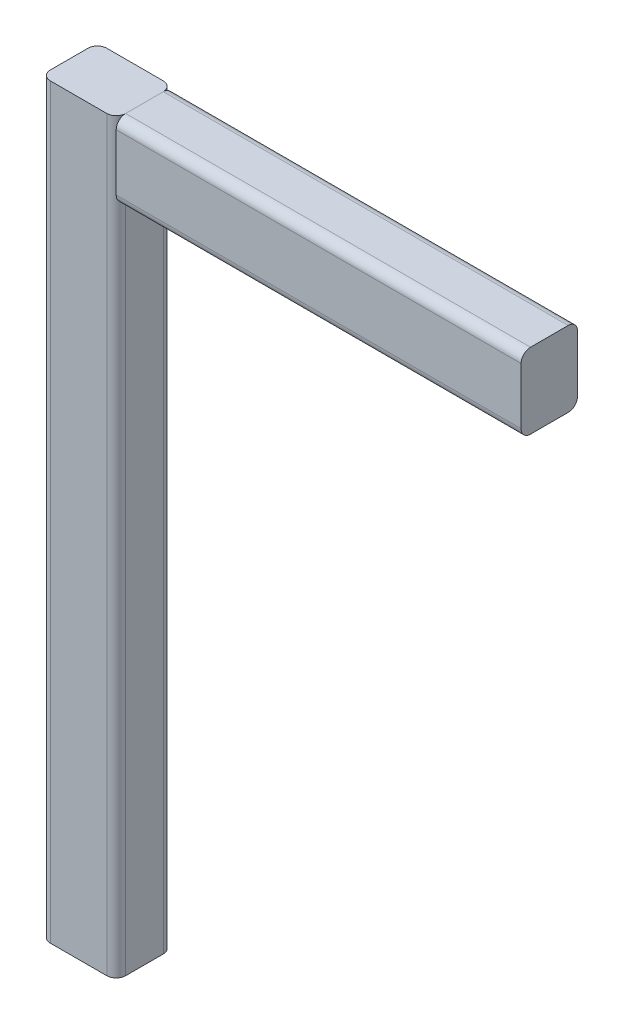
ISO-10303-21;
HEADER;
FILE_DESCRIPTION(('STEP AP214'),'2;1');
FILE_NAME('part.step','',(''),(''),'','','');
FILE_SCHEMA(('AUTOMOTIVE_DESIGN { 1 0 10303 214 1 1 1 1 }'));
ENDSEC;
DATA;
#1=APPLICATION_CONTEXT('core data for automotive mechanical design processes');
#2=APPLICATION_PROTOCOL_DEFINITION('international standard','automotive_design',2000,#1);
#3=PRODUCT_CONTEXT('',#1,'mechanical');
#4=PRODUCT('Part','Part','',(#3));
#5=PRODUCT_RELATED_PRODUCT_CATEGORY('part','',(#4));
#6=PRODUCT_DEFINITION_FORMATION('','',#4);
#7=PRODUCT_DEFINITION_CONTEXT('part definition',#1,'design');
#8=PRODUCT_DEFINITION('design','',#6,#7);
#9=PRODUCT_DEFINITION_SHAPE('','',#8);
#10=(LENGTH_UNIT() NAMED_UNIT(*) SI_UNIT(.MILLI.,.METRE.));
#11=(NAMED_UNIT(*) PLANE_ANGLE_UNIT() SI_UNIT($,.RADIAN.));
#12=(NAMED_UNIT(*) SI_UNIT($,.STERADIAN.) SOLID_ANGLE_UNIT());
#13=UNCERTAINTY_MEASURE_WITH_UNIT(LENGTH_MEASURE(1.E-05),#10,'distance_accuracy_value','');
#14=(GEOMETRIC_REPRESENTATION_CONTEXT(3) GLOBAL_UNCERTAINTY_ASSIGNED_CONTEXT((#13)) GLOBAL_UNIT_ASSIGNED_CONTEXT((#10,
#11,#12)) REPRESENTATION_CONTEXT('',''));
#15=CARTESIAN_POINT('',(0.,0.,0.));
#16=DIRECTION('',(0.,0.,1.));
#17=DIRECTION('',(1.,0.,0.));
#18=AXIS2_PLACEMENT_3D('',#15,#16,#17);
#19=CARTESIAN_POINT('',(430.,0.,0.));
#20=DIRECTION('',(0.,0.,-1.));
#21=DIRECTION('',(0.,1.,0.));
#22=AXIS2_PLACEMENT_3D('',#19,#20,#21);
#23=PLANE('',#22);
#24=DIRECTION('',(0.,-1.,0.));
#25=VECTOR('',#24,1.);
#26=CARTESIAN_POINT('',(0.,0.,0.));
#27=LINE('',#26,#25);
#28=CARTESIAN_POINT('',(0.,-10.,0.));
#29=VERTEX_POINT('',#28);
#30=CARTESIAN_POINT('',(0.,-70.,0.));
#31=VERTEX_POINT('',#30);
#32=EDGE_CURVE('E142',#29,#31,#27,.T.);
#33=ORIENTED_EDGE('',*,*,#32,.T.);
#34=DIRECTION('',(-1.,0.,0.));
#35=VECTOR('',#34,1.);
#36=CARTESIAN_POINT('',(430.,-70.,0.));
#37=LINE('',#36,#35);
#38=CARTESIAN_POINT('',(430.,-70.,0.));
#39=VERTEX_POINT('',#38);
#40=EDGE_CURVE('E12',#31,#39,#37,.F.);
#41=ORIENTED_EDGE('',*,*,#40,.T.);
#42=DIRECTION('',(0.,-1.,0.));
#43=VECTOR('',#42,1.);
#44=CARTESIAN_POINT('',(430.,0.,0.));
#45=LINE('',#44,#43);
#46=CARTESIAN_POINT('',(430.,-10.,0.));
#47=VERTEX_POINT('',#46);
#48=EDGE_CURVE('E140',#47,#39,#45,.T.);
#49=ORIENTED_EDGE('',*,*,#48,.F.);
#50=DIRECTION('',(-1.,0.,0.));
#51=VECTOR('',#50,1.);
#52=CARTESIAN_POINT('',(430.,-10.,0.));
#53=LINE('',#52,#51);
#54=EDGE_CURVE('E54',#47,#29,#53,.T.);
#55=ORIENTED_EDGE('',*,*,#54,.T.);
#56=EDGE_LOOP('',(#33,#41,#49,#55));
#57=FACE_BOUND('',#56,.T.);
#58=ADVANCED_FACE('F46',(#57),#23,.F.);
#59=CARTESIAN_POINT('',(430.,-80.,0.));
#60=DIRECTION('',(0.,1.,0.));
#61=DIRECTION('',(0.,0.,1.));
#62=AXIS2_PLACEMENT_3D('',#59,#60,#61);
#63=PLANE('',#62);
#64=DIRECTION('',(0.,0.,-1.));
#65=VECTOR('',#64,1.);
#66=CARTESIAN_POINT('',(0.,-80.,0.));
#67=LINE('',#66,#65);
#68=CARTESIAN_POINT('',(0.,-80.,-10.));
#69=VERTEX_POINT('',#68);
#70=CARTESIAN_POINT('',(0.,-80.,-50.));
#71=VERTEX_POINT('',#70);
#72=EDGE_CURVE('E138',#69,#71,#67,.T.);
#73=ORIENTED_EDGE('',*,*,#72,.T.);
#74=DIRECTION('',(-1.,0.,0.));
#75=VECTOR('',#74,1.);
#76=CARTESIAN_POINT('',(430.,-80.,-50.));
#77=LINE('',#76,#75);
#78=CARTESIAN_POINT('',(430.,-80.,-50.));
#79=VERTEX_POINT('',#78);
#80=EDGE_CURVE('E117',#71,#79,#77,.F.);
#81=ORIENTED_EDGE('',*,*,#80,.T.);
#82=DIRECTION('',(0.,0.,-1.));
#83=VECTOR('',#82,1.);
#84=CARTESIAN_POINT('',(430.,-80.,0.));
#85=LINE('',#84,#83);
#86=CARTESIAN_POINT('',(430.,-80.,-10.));
#87=VERTEX_POINT('',#86);
#88=EDGE_CURVE('E178',#87,#79,#85,.T.);
#89=ORIENTED_EDGE('',*,*,#88,.F.);
#90=DIRECTION('',(-1.,0.,0.));
#91=VECTOR('',#90,1.);
#92=CARTESIAN_POINT('',(430.,-80.,-10.));
#93=LINE('',#92,#91);
#94=EDGE_CURVE('E122',#87,#69,#93,.T.);
#95=ORIENTED_EDGE('',*,*,#94,.T.);
#96=EDGE_LOOP('',(#73,#81,#89,#95));
#97=FACE_BOUND('',#96,.T.);
#98=ADVANCED_FACE('F188',(#97),#63,.F.);
#99=CARTESIAN_POINT('',(430.,0.,-60.));
#100=DIRECTION('',(0.,0.,1.));
#101=DIRECTION('',(1.,0.,0.));
#102=AXIS2_PLACEMENT_3D('',#99,#100,#101);
#103=PLANE('',#102);
#104=DIRECTION('',(0.,1.,0.));
#105=VECTOR('',#104,1.);
#106=CARTESIAN_POINT('',(430.,0.,-60.));
#107=LINE('',#106,#105);
#108=CARTESIAN_POINT('',(430.,-70.,-60.));
#109=VERTEX_POINT('',#108);
#110=CARTESIAN_POINT('',(430.,-10.,-60.));
#111=VERTEX_POINT('',#110);
#112=EDGE_CURVE('E131',#109,#111,#107,.T.);
#113=ORIENTED_EDGE('',*,*,#112,.F.);
#114=DIRECTION('',(-1.,0.,0.));
#115=VECTOR('',#114,1.);
#116=CARTESIAN_POINT('',(430.,-70.,-60.));
#117=LINE('',#116,#115);
#118=CARTESIAN_POINT('',(0.,-70.,-60.));
#119=VERTEX_POINT('',#118);
#120=EDGE_CURVE('E116',#109,#119,#117,.T.);
#121=ORIENTED_EDGE('',*,*,#120,.T.);
#122=DIRECTION('',(0.,1.,0.));
#123=VECTOR('',#122,1.);
#124=CARTESIAN_POINT('',(0.,0.,-60.));
#125=LINE('',#124,#123);
#126=CARTESIAN_POINT('',(0.,-10.,-60.));
#127=VERTEX_POINT('',#126);
#128=EDGE_CURVE('E129',#119,#127,#125,.T.);
#129=ORIENTED_EDGE('',*,*,#128,.T.);
#130=DIRECTION('',(-1.,0.,0.));
#131=VECTOR('',#130,1.);
#132=CARTESIAN_POINT('',(430.,-10.,-60.));
#133=LINE('',#132,#131);
#134=EDGE_CURVE('E133',#127,#111,#133,.F.);
#135=ORIENTED_EDGE('',*,*,#134,.T.);
#136=EDGE_LOOP('',(#113,#121,#129,#135));
#137=FACE_BOUND('',#136,.T.);
#138=ADVANCED_FACE('F128',(#137),#103,.F.);
#139=CARTESIAN_POINT('',(430.,0.,0.));
#140=DIRECTION('',(0.,-1.,0.));
#141=DIRECTION('',(0.,0.,-1.));
#142=AXIS2_PLACEMENT_3D('',#139,#140,#141);
#143=PLANE('',#142);
#144=DIRECTION('',(0.,0.,1.));
#145=VECTOR('',#144,1.);
#146=CARTESIAN_POINT('',(430.,0.,0.));
#147=LINE('',#146,#145);
#148=CARTESIAN_POINT('',(430.,0.,-50.));
#149=VERTEX_POINT('',#148);
#150=CARTESIAN_POINT('',(430.,0.,-10.));
#151=VERTEX_POINT('',#150);
#152=EDGE_CURVE('E146',#149,#151,#147,.T.);
#153=ORIENTED_EDGE('',*,*,#152,.F.);
#154=DIRECTION('',(-1.,0.,0.));
#155=VECTOR('',#154,1.);
#156=CARTESIAN_POINT('',(430.,0.,-50.));
#157=LINE('',#156,#155);
#158=CARTESIAN_POINT('',(0.,0.,-50.));
#159=VERTEX_POINT('',#158);
#160=EDGE_CURVE('E163',#149,#159,#157,.T.);
#161=ORIENTED_EDGE('',*,*,#160,.T.);
#162=DIRECTION('',(0.,0.,1.));
#163=VECTOR('',#162,1.);
#164=CARTESIAN_POINT('',(0.,0.,0.));
#165=LINE('',#164,#163);
#166=CARTESIAN_POINT('',(0.,0.,-10.));
#167=VERTEX_POINT('',#166);
#168=EDGE_CURVE('E137',#159,#167,#165,.T.);
#169=ORIENTED_EDGE('',*,*,#168,.T.);
#170=DIRECTION('',(-1.,0.,0.));
#171=VECTOR('',#170,1.);
#172=CARTESIAN_POINT('',(430.,0.,-10.));
#173=LINE('',#172,#171);
#174=EDGE_CURVE('E61',#167,#151,#173,.F.);
#175=ORIENTED_EDGE('',*,*,#174,.T.);
#176=EDGE_LOOP('',(#153,#161,#169,#175));
#177=FACE_BOUND('',#176,.T.);
#178=ADVANCED_FACE('F192',(#177),#143,.F.);
#179=CARTESIAN_POINT('',(430.,0.,0.));
#180=DIRECTION('',(1.,0.,0.));
#181=DIRECTION('',(0.,0.,-1.));
#182=AXIS2_PLACEMENT_3D('',#179,#180,#181);
#183=PLANE('',#182);
#184=ORIENTED_EDGE('',*,*,#88,.T.);
#185=CARTESIAN_POINT('',(430.,-70.,-50.));
#186=DIRECTION('',(1.,0.,0.));
#187=DIRECTION('',(0.,0.,-1.));
#188=AXIS2_PLACEMENT_3D('',#185,#186,#187);
#189=CIRCLE('',#188,10.);
#190=EDGE_CURVE('E160',#79,#109,#189,.T.);
#191=ORIENTED_EDGE('',*,*,#190,.T.);
#192=ORIENTED_EDGE('',*,*,#112,.T.);
#193=CARTESIAN_POINT('',(430.,-10.,-50.));
#194=DIRECTION('',(1.,0.,0.));
#195=DIRECTION('',(0.,0.,-1.));
#196=AXIS2_PLACEMENT_3D('',#193,#194,#195);
#197=CIRCLE('',#196,10.);
#198=EDGE_CURVE('E68',#111,#149,#197,.T.);
#199=ORIENTED_EDGE('',*,*,#198,.T.);
#200=ORIENTED_EDGE('',*,*,#152,.T.);
#201=CARTESIAN_POINT('',(430.,-10.,-10.));
#202=DIRECTION('',(1.,0.,0.));
#203=DIRECTION('',(0.,0.,-1.));
#204=AXIS2_PLACEMENT_3D('',#201,#202,#203);
#205=CIRCLE('',#204,10.);
#206=EDGE_CURVE('E155',#151,#47,#205,.T.);
#207=ORIENTED_EDGE('',*,*,#206,.T.);
#208=ORIENTED_EDGE('',*,*,#48,.T.);
#209=CARTESIAN_POINT('',(430.,-70.,-10.));
#210=DIRECTION('',(1.,0.,0.));
#211=DIRECTION('',(0.,0.,-1.));
#212=AXIS2_PLACEMENT_3D('',#209,#210,#211);
#213=CIRCLE('',#212,10.);
#214=EDGE_CURVE('E157',#39,#87,#213,.T.);
#215=ORIENTED_EDGE('',*,*,#214,.T.);
#216=EDGE_LOOP('',(#184,#191,#192,#199,#200,#207,#208,#215));
#217=FACE_BOUND('',#216,.T.);
#218=ADVANCED_FACE('F182',(#217),#183,.T.);
#219=CARTESIAN_POINT('',(0.,0.,0.));
#220=DIRECTION('',(1.,0.,0.));
#221=DIRECTION('',(0.,0.,-1.));
#222=AXIS2_PLACEMENT_3D('',#219,#220,#221);
#223=PLANE('',#222);
#224=ORIENTED_EDGE('',*,*,#128,.F.);
#225=CARTESIAN_POINT('',(0.,-70.,-50.));
#226=DIRECTION('',(1.,0.,0.));
#227=DIRECTION('',(0.,0.,-1.));
#228=AXIS2_PLACEMENT_3D('',#225,#226,#227);
#229=CIRCLE('',#228,10.);
#230=EDGE_CURVE('E112',#119,#71,#229,.F.);
#231=ORIENTED_EDGE('',*,*,#230,.T.);
#232=ORIENTED_EDGE('',*,*,#72,.F.);
#233=CARTESIAN_POINT('',(0.,-70.,-10.));
#234=DIRECTION('',(1.,0.,0.));
#235=DIRECTION('',(0.,0.,-1.));
#236=AXIS2_PLACEMENT_3D('',#233,#234,#235);
#237=CIRCLE('',#236,10.);
#238=EDGE_CURVE('E149',#69,#31,#237,.F.);
#239=ORIENTED_EDGE('',*,*,#238,.T.);
#240=ORIENTED_EDGE('',*,*,#32,.F.);
#241=CARTESIAN_POINT('',(0.,-10.,-10.));
#242=DIRECTION('',(1.,0.,0.));
#243=DIRECTION('',(0.,0.,-1.));
#244=AXIS2_PLACEMENT_3D('',#241,#242,#243);
#245=CIRCLE('',#244,10.);
#246=EDGE_CURVE('E132',#29,#167,#245,.F.);
#247=ORIENTED_EDGE('',*,*,#246,.T.);
#248=ORIENTED_EDGE('',*,*,#168,.F.);
#249=CARTESIAN_POINT('',(0.,-10.,-50.));
#250=DIRECTION('',(1.,0.,0.));
#251=DIRECTION('',(0.,0.,-1.));
#252=AXIS2_PLACEMENT_3D('',#249,#250,#251);
#253=CIRCLE('',#252,10.);
#254=EDGE_CURVE('E123',#159,#127,#253,.F.);
#255=ORIENTED_EDGE('',*,*,#254,.T.);
#256=EDGE_LOOP('',(#224,#231,#232,#239,#240,#247,#248,#255));
#257=FACE_BOUND('',#256,.T.);
#258=ADVANCED_FACE('F135',(#257),#223,.F.);
#259=CARTESIAN_POINT('',(430.,-70.,-50.));
#260=DIRECTION('',(-1.,0.,0.));
#261=DIRECTION('',(0.,0.,1.));
#262=AXIS2_PLACEMENT_3D('',#259,#260,#261);
#263=CYLINDRICAL_SURFACE('',#262,10.);
#264=ORIENTED_EDGE('',*,*,#190,.F.);
#265=ORIENTED_EDGE('',*,*,#80,.F.);
#266=ORIENTED_EDGE('',*,*,#230,.F.);
#267=ORIENTED_EDGE('',*,*,#120,.F.);
#268=EDGE_LOOP('',(#264,#265,#266,#267));
#269=FACE_BOUND('',#268,.T.);
#270=ADVANCED_FACE('F115',(#269),#263,.T.);
#271=CARTESIAN_POINT('',(430.,-10.,-50.));
#272=DIRECTION('',(-1.,0.,0.));
#273=DIRECTION('',(0.,0.,1.));
#274=AXIS2_PLACEMENT_3D('',#271,#272,#273);
#275=CYLINDRICAL_SURFACE('',#274,10.);
#276=ORIENTED_EDGE('',*,*,#198,.F.);
#277=ORIENTED_EDGE('',*,*,#134,.F.);
#278=ORIENTED_EDGE('',*,*,#254,.F.);
#279=ORIENTED_EDGE('',*,*,#160,.F.);
#280=EDGE_LOOP('',(#276,#277,#278,#279));
#281=FACE_BOUND('',#280,.T.);
#282=ADVANCED_FACE('F191',(#281),#275,.T.);
#283=CARTESIAN_POINT('',(430.,-70.,-10.));
#284=DIRECTION('',(-1.,0.,0.));
#285=DIRECTION('',(0.,0.,1.));
#286=AXIS2_PLACEMENT_3D('',#283,#284,#285);
#287=CYLINDRICAL_SURFACE('',#286,10.);
#288=ORIENTED_EDGE('',*,*,#214,.F.);
#289=ORIENTED_EDGE('',*,*,#40,.F.);
#290=ORIENTED_EDGE('',*,*,#238,.F.);
#291=ORIENTED_EDGE('',*,*,#94,.F.);
#292=EDGE_LOOP('',(#288,#289,#290,#291));
#293=FACE_BOUND('',#292,.T.);
#294=ADVANCED_FACE('F186',(#293),#287,.T.);
#295=CARTESIAN_POINT('',(430.,-10.,-10.));
#296=DIRECTION('',(-1.,0.,0.));
#297=DIRECTION('',(0.,0.,1.));
#298=AXIS2_PLACEMENT_3D('',#295,#296,#297);
#299=CYLINDRICAL_SURFACE('',#298,10.);
#300=ORIENTED_EDGE('',*,*,#206,.F.);
#301=ORIENTED_EDGE('',*,*,#174,.F.);
#302=ORIENTED_EDGE('',*,*,#246,.F.);
#303=ORIENTED_EDGE('',*,*,#54,.F.);
#304=EDGE_LOOP('',(#300,#301,#302,#303));
#305=FACE_BOUND('',#304,.T.);
#306=ADVANCED_FACE('F48',(#305),#299,.T.);
#307=CLOSED_SHELL('',(#58,#98,#138,#178,#218,#258,#270,#282,#294,#306));
#308=MANIFOLD_SOLID_BREP('B2',#307);
#309=CARTESIAN_POINT('',(0.,0.,-60.));
#310=DIRECTION('',(1.,0.,0.));
#311=DIRECTION('',(0.,0.,-1.));
#312=AXIS2_PLACEMENT_3D('',#309,#310,#311);
#313=PLANE('',#312);
#314=DIRECTION('',(0.,0.,1.));
#315=VECTOR('',#314,1.);
#316=CARTESIAN_POINT('',(0.,-793.139508353882,-60.));
#317=LINE('',#316,#315);
#318=CARTESIAN_POINT('',(0.,-793.139508353882,-50.));
#319=VERTEX_POINT('',#318);
#320=CARTESIAN_POINT('',(0.,-793.139508353882,-10.));
#321=VERTEX_POINT('',#320);
#322=EDGE_CURVE('E389',#319,#321,#317,.T.);
#323=ORIENTED_EDGE('',*,*,#322,.F.);
#324=DIRECTION('',(0.,1.,0.));
#325=VECTOR('',#324,1.);
#326=CARTESIAN_POINT('',(0.,0.,-50.));
#327=LINE('',#326,#325);
#328=CARTESIAN_POINT('',(0.,0.,-50.));
#329=VERTEX_POINT('',#328);
#330=EDGE_CURVE('E406',#319,#329,#327,.T.);
#331=ORIENTED_EDGE('',*,*,#330,.T.);
#332=DIRECTION('',(0.,0.,1.));
#333=VECTOR('',#332,1.);
#334=CARTESIAN_POINT('',(0.,0.,-60.));
#335=LINE('',#334,#333);
#336=CARTESIAN_POINT('',(0.,0.,-10.));
#337=VERTEX_POINT('',#336);
#338=EDGE_CURVE('E381',#329,#337,#335,.T.);
#339=ORIENTED_EDGE('',*,*,#338,.T.);
#340=DIRECTION('',(0.,1.,0.));
#341=VECTOR('',#340,1.);
#342=CARTESIAN_POINT('',(0.,-793.139508353882,-10.));
#343=LINE('',#342,#341);
#344=EDGE_CURVE('E370',#337,#321,#343,.F.);
#345=ORIENTED_EDGE('',*,*,#344,.T.);
#346=EDGE_LOOP('',(#323,#331,#339,#345));
#347=FACE_BOUND('',#346,.T.);
#348=ADVANCED_FACE('F293',(#347),#313,.T.);
#349=CARTESIAN_POINT('',(0.,-793.139508353882,-60.));
#350=DIRECTION('',(0.,-1.,0.));
#351=DIRECTION('',(0.,0.,-1.));
#352=AXIS2_PLACEMENT_3D('',#349,#350,#351);
#353=PLANE('',#352);
#354=DIRECTION('',(0.,0.,1.));
#355=VECTOR('',#354,1.);
#356=CARTESIAN_POINT('',(-80.,-793.139508353882,-60.));
#357=LINE('',#356,#355);
#358=CARTESIAN_POINT('',(-80.,-793.139508353882,-50.));
#359=VERTEX_POINT('',#358);
#360=CARTESIAN_POINT('',(-80.,-793.139508353882,-10.));
#361=VERTEX_POINT('',#360);
#362=EDGE_CURVE('E380',#359,#361,#357,.T.);
#363=ORIENTED_EDGE('',*,*,#362,.F.);
#364=CARTESIAN_POINT('',(-70.,-793.139508353882,-50.));
#365=DIRECTION('',(0.,-1.,0.));
#366=DIRECTION('',(0.,0.,-1.));
#367=AXIS2_PLACEMENT_3D('',#364,#365,#366);
#368=CIRCLE('',#367,10.);
#369=CARTESIAN_POINT('',(-70.,-793.139508353882,-60.));
#370=VERTEX_POINT('',#369);
#371=EDGE_CURVE('E384',#359,#370,#368,.T.);
#372=ORIENTED_EDGE('',*,*,#371,.T.);
#373=DIRECTION('',(1.,0.,0.));
#374=VECTOR('',#373,1.);
#375=CARTESIAN_POINT('',(0.,-793.139508353882,-60.));
#376=LINE('',#375,#374);
#377=CARTESIAN_POINT('',(-10.,-793.139508353882,-60.));
#378=VERTEX_POINT('',#377);
#379=EDGE_CURVE('E422',#370,#378,#376,.T.);
#380=ORIENTED_EDGE('',*,*,#379,.T.);
#381=CARTESIAN_POINT('',(-10.,-793.139508353882,-50.));
#382=DIRECTION('',(0.,-1.,0.));
#383=DIRECTION('',(0.,0.,-1.));
#384=AXIS2_PLACEMENT_3D('',#381,#382,#383);
#385=CIRCLE('',#384,10.);
#386=EDGE_CURVE('E394',#378,#319,#385,.T.);
#387=ORIENTED_EDGE('',*,*,#386,.T.);
#388=ORIENTED_EDGE('',*,*,#322,.T.);
#389=CARTESIAN_POINT('',(-10.,-793.139508353882,-10.));
#390=DIRECTION('',(0.,-1.,0.));
#391=DIRECTION('',(0.,0.,-1.));
#392=AXIS2_PLACEMENT_3D('',#389,#390,#391);
#393=CIRCLE('',#392,10.);
#394=CARTESIAN_POINT('',(-10.,-793.139508353882,0.));
#395=VERTEX_POINT('',#394);
#396=EDGE_CURVE('E385',#321,#395,#393,.T.);
#397=ORIENTED_EDGE('',*,*,#396,.T.);
#398=DIRECTION('',(1.,0.,0.));
#399=VECTOR('',#398,1.);
#400=CARTESIAN_POINT('',(0.,-793.139508353882,0.));
#401=LINE('',#400,#399);
#402=CARTESIAN_POINT('',(-70.,-793.139508353882,0.));
#403=VERTEX_POINT('',#402);
#404=EDGE_CURVE('E416',#403,#395,#401,.T.);
#405=ORIENTED_EDGE('',*,*,#404,.F.);
#406=CARTESIAN_POINT('',(-70.,-793.139508353882,-10.));
#407=DIRECTION('',(0.,-1.,0.));
#408=DIRECTION('',(0.,0.,-1.));
#409=AXIS2_PLACEMENT_3D('',#406,#407,#408);
#410=CIRCLE('',#409,10.);
#411=EDGE_CURVE('E387',#403,#361,#410,.T.);
#412=ORIENTED_EDGE('',*,*,#411,.T.);
#413=EDGE_LOOP('',(#363,#372,#380,#387,#388,#397,#405,#412));
#414=FACE_BOUND('',#413,.T.);
#415=ADVANCED_FACE('F433',(#414),#353,.T.);
#416=CARTESIAN_POINT('',(-80.,0.,-60.));
#417=DIRECTION('',(-1.,0.,0.));
#418=DIRECTION('',(0.,-1.,0.));
#419=AXIS2_PLACEMENT_3D('',#416,#417,#418);
#420=PLANE('',#419);
#421=DIRECTION('',(0.,0.,1.));
#422=VECTOR('',#421,1.);
#423=CARTESIAN_POINT('',(-80.,0.,-60.));
#424=LINE('',#423,#422);
#425=CARTESIAN_POINT('',(-80.,0.,-50.));
#426=VERTEX_POINT('',#425);
#427=CARTESIAN_POINT('',(-80.,0.,-10.));
#428=VERTEX_POINT('',#427);
#429=EDGE_CURVE('E363',#426,#428,#424,.T.);
#430=ORIENTED_EDGE('',*,*,#429,.F.);
#431=DIRECTION('',(0.,-1.,0.));
#432=VECTOR('',#431,1.);
#433=CARTESIAN_POINT('',(-80.,0.,-50.));
#434=LINE('',#433,#432);
#435=EDGE_CURVE('E376',#426,#359,#434,.T.);
#436=ORIENTED_EDGE('',*,*,#435,.T.);
#437=ORIENTED_EDGE('',*,*,#362,.T.);
#438=DIRECTION('',(0.,-1.,0.));
#439=VECTOR('',#438,1.);
#440=CARTESIAN_POINT('',(-80.,0.,-10.));
#441=LINE('',#440,#439);
#442=EDGE_CURVE('E379',#361,#428,#441,.F.);
#443=ORIENTED_EDGE('',*,*,#442,.T.);
#444=EDGE_LOOP('',(#430,#436,#437,#443));
#445=FACE_BOUND('',#444,.T.);
#446=ADVANCED_FACE('F374',(#445),#420,.T.);
#447=CARTESIAN_POINT('',(0.,0.,-60.));
#448=DIRECTION('',(0.,1.,0.));
#449=DIRECTION('',(-1.,0.,0.));
#450=AXIS2_PLACEMENT_3D('',#447,#448,#449);
#451=PLANE('',#450);
#452=DIRECTION('',(-1.,0.,0.));
#453=VECTOR('',#452,1.);
#454=CARTESIAN_POINT('',(0.,0.,-60.));
#455=LINE('',#454,#453);
#456=CARTESIAN_POINT('',(-10.,0.,-60.));
#457=VERTEX_POINT('',#456);
#458=CARTESIAN_POINT('',(-70.,0.,-60.));
#459=VERTEX_POINT('',#458);
#460=EDGE_CURVE('E366',#457,#459,#455,.T.);
#461=ORIENTED_EDGE('',*,*,#460,.T.);
#462=CARTESIAN_POINT('',(-70.,0.,-50.));
#463=DIRECTION('',(0.,1.,0.));
#464=DIRECTION('',(-1.,0.,0.));
#465=AXIS2_PLACEMENT_3D('',#462,#463,#464);
#466=CIRCLE('',#465,10.);
#467=EDGE_CURVE('E360',#459,#426,#466,.T.);
#468=ORIENTED_EDGE('',*,*,#467,.T.);
#469=ORIENTED_EDGE('',*,*,#429,.T.);
#470=CARTESIAN_POINT('',(-70.,0.,-10.));
#471=DIRECTION('',(0.,1.,0.));
#472=DIRECTION('',(-1.,0.,0.));
#473=AXIS2_PLACEMENT_3D('',#470,#471,#472);
#474=CIRCLE('',#473,10.);
#475=CARTESIAN_POINT('',(-70.,0.,0.));
#476=VERTEX_POINT('',#475);
#477=EDGE_CURVE('E402',#428,#476,#474,.T.);
#478=ORIENTED_EDGE('',*,*,#477,.T.);
#479=DIRECTION('',(-1.,0.,0.));
#480=VECTOR('',#479,1.);
#481=CARTESIAN_POINT('',(0.,0.,0.));
#482=LINE('',#481,#480);
#483=CARTESIAN_POINT('',(-10.,0.,0.));
#484=VERTEX_POINT('',#483);
#485=EDGE_CURVE('E413',#484,#476,#482,.T.);
#486=ORIENTED_EDGE('',*,*,#485,.F.);
#487=CARTESIAN_POINT('',(-10.,0.,-10.));
#488=DIRECTION('',(0.,1.,0.));
#489=DIRECTION('',(-1.,0.,0.));
#490=AXIS2_PLACEMENT_3D('',#487,#488,#489);
#491=CIRCLE('',#490,10.);
#492=EDGE_CURVE('E308',#484,#337,#491,.T.);
#493=ORIENTED_EDGE('',*,*,#492,.T.);
#494=ORIENTED_EDGE('',*,*,#338,.F.);
#495=CARTESIAN_POINT('',(-10.,0.,-50.));
#496=DIRECTION('',(0.,1.,0.));
#497=DIRECTION('',(-1.,0.,0.));
#498=AXIS2_PLACEMENT_3D('',#495,#496,#497);
#499=CIRCLE('',#498,10.);
#500=EDGE_CURVE('E316',#329,#457,#499,.T.);
#501=ORIENTED_EDGE('',*,*,#500,.T.);
#502=EDGE_LOOP('',(#461,#468,#469,#478,#486,#493,#494,#501));
#503=FACE_BOUND('',#502,.T.);
#504=ADVANCED_FACE('F362',(#503),#451,.T.);
#505=CARTESIAN_POINT('',(0.,0.,-60.));
#506=DIRECTION('',(0.,0.,-1.));
#507=DIRECTION('',(-1.,0.,0.));
#508=AXIS2_PLACEMENT_3D('',#505,#506,#507);
#509=PLANE('',#508);
#510=ORIENTED_EDGE('',*,*,#379,.F.);
#511=DIRECTION('',(0.,-1.,0.));
#512=VECTOR('',#511,1.);
#513=CARTESIAN_POINT('',(-70.,0.,-60.));
#514=LINE('',#513,#512);
#515=EDGE_CURVE('E399',#370,#459,#514,.F.);
#516=ORIENTED_EDGE('',*,*,#515,.T.);
#517=ORIENTED_EDGE('',*,*,#460,.F.);
#518=DIRECTION('',(0.,1.,0.));
#519=VECTOR('',#518,1.);
#520=CARTESIAN_POINT('',(-10.,0.,-60.));
#521=LINE('',#520,#519);
#522=EDGE_CURVE('E397',#457,#378,#521,.F.);
#523=ORIENTED_EDGE('',*,*,#522,.T.);
#524=EDGE_LOOP('',(#510,#516,#517,#523));
#525=FACE_BOUND('',#524,.T.);
#526=ADVANCED_FACE('F437',(#525),#509,.T.);
#527=CARTESIAN_POINT('',(0.,0.,0.));
#528=DIRECTION('',(0.,0.,-1.));
#529=DIRECTION('',(-1.,0.,0.));
#530=AXIS2_PLACEMENT_3D('',#527,#528,#529);
#531=PLANE('',#530);
#532=ORIENTED_EDGE('',*,*,#485,.T.);
#533=DIRECTION('',(0.,-1.,0.));
#534=VECTOR('',#533,1.);
#535=CARTESIAN_POINT('',(-70.,-793.139508353882,0.));
#536=LINE('',#535,#534);
#537=EDGE_CURVE('E44',#476,#403,#536,.T.);
#538=ORIENTED_EDGE('',*,*,#537,.T.);
#539=ORIENTED_EDGE('',*,*,#404,.T.);
#540=DIRECTION('',(0.,1.,0.));
#541=VECTOR('',#540,1.);
#542=CARTESIAN_POINT('',(-10.,0.,0.));
#543=LINE('',#542,#541);
#544=EDGE_CURVE('E301',#395,#484,#543,.T.);
#545=ORIENTED_EDGE('',*,*,#544,.T.);
#546=EDGE_LOOP('',(#532,#538,#539,#545));
#547=FACE_BOUND('',#546,.T.);
#548=ADVANCED_FACE('F412',(#547),#531,.F.);
#549=CARTESIAN_POINT('',(-70.,0.,-50.));
#550=DIRECTION('',(0.,-1.,0.));
#551=DIRECTION('',(1.,0.,0.));
#552=AXIS2_PLACEMENT_3D('',#549,#550,#551);
#553=CYLINDRICAL_SURFACE('',#552,10.);
#554=ORIENTED_EDGE('',*,*,#467,.F.);
#555=ORIENTED_EDGE('',*,*,#515,.F.);
#556=ORIENTED_EDGE('',*,*,#371,.F.);
#557=ORIENTED_EDGE('',*,*,#435,.F.);
#558=EDGE_LOOP('',(#554,#555,#556,#557));
#559=FACE_BOUND('',#558,.T.);
#560=ADVANCED_FACE('F383',(#559),#553,.T.);
#561=CARTESIAN_POINT('',(-10.,0.,-50.));
#562=DIRECTION('',(0.,1.,0.));
#563=DIRECTION('',(0.,0.,1.));
#564=AXIS2_PLACEMENT_3D('',#561,#562,#563);
#565=CYLINDRICAL_SURFACE('',#564,10.);
#566=ORIENTED_EDGE('',*,*,#386,.F.);
#567=ORIENTED_EDGE('',*,*,#522,.F.);
#568=ORIENTED_EDGE('',*,*,#500,.F.);
#569=ORIENTED_EDGE('',*,*,#330,.F.);
#570=EDGE_LOOP('',(#566,#567,#568,#569));
#571=FACE_BOUND('',#570,.T.);
#572=ADVANCED_FACE('F436',(#571),#565,.T.);
#573=CARTESIAN_POINT('',(-70.,0.,-10.));
#574=DIRECTION('',(0.,1.,0.));
#575=DIRECTION('',(-1.,0.,0.));
#576=AXIS2_PLACEMENT_3D('',#573,#574,#575);
#577=CYLINDRICAL_SURFACE('',#576,10.);
#578=ORIENTED_EDGE('',*,*,#477,.F.);
#579=ORIENTED_EDGE('',*,*,#442,.F.);
#580=ORIENTED_EDGE('',*,*,#411,.F.);
#581=ORIENTED_EDGE('',*,*,#537,.F.);
#582=EDGE_LOOP('',(#578,#579,#580,#581));
#583=FACE_BOUND('',#582,.T.);
#584=ADVANCED_FACE('F457',(#583),#577,.T.);
#585=CARTESIAN_POINT('',(-10.,0.,-10.));
#586=DIRECTION('',(0.,-1.,0.));
#587=DIRECTION('',(0.,0.,-1.));
#588=AXIS2_PLACEMENT_3D('',#585,#586,#587);
#589=CYLINDRICAL_SURFACE('',#588,10.);
#590=ORIENTED_EDGE('',*,*,#396,.F.);
#591=ORIENTED_EDGE('',*,*,#344,.F.);
#592=ORIENTED_EDGE('',*,*,#492,.F.);
#593=ORIENTED_EDGE('',*,*,#544,.F.);
#594=EDGE_LOOP('',(#590,#591,#592,#593));
#595=FACE_BOUND('',#594,.T.);
#596=ADVANCED_FACE('F295',(#595),#589,.T.);
#597=CLOSED_SHELL('',(#348,#415,#446,#504,#526,#548,#560,#572,#584,#596));
#598=MANIFOLD_SOLID_BREP('B6',#597);
#599=ADVANCED_BREP_SHAPE_REPRESENTATION('',(#18,#308,#598),#14);
#600=SHAPE_DEFINITION_REPRESENTATION(#9,#599);
ENDSEC;
END-ISO-10303-21;
